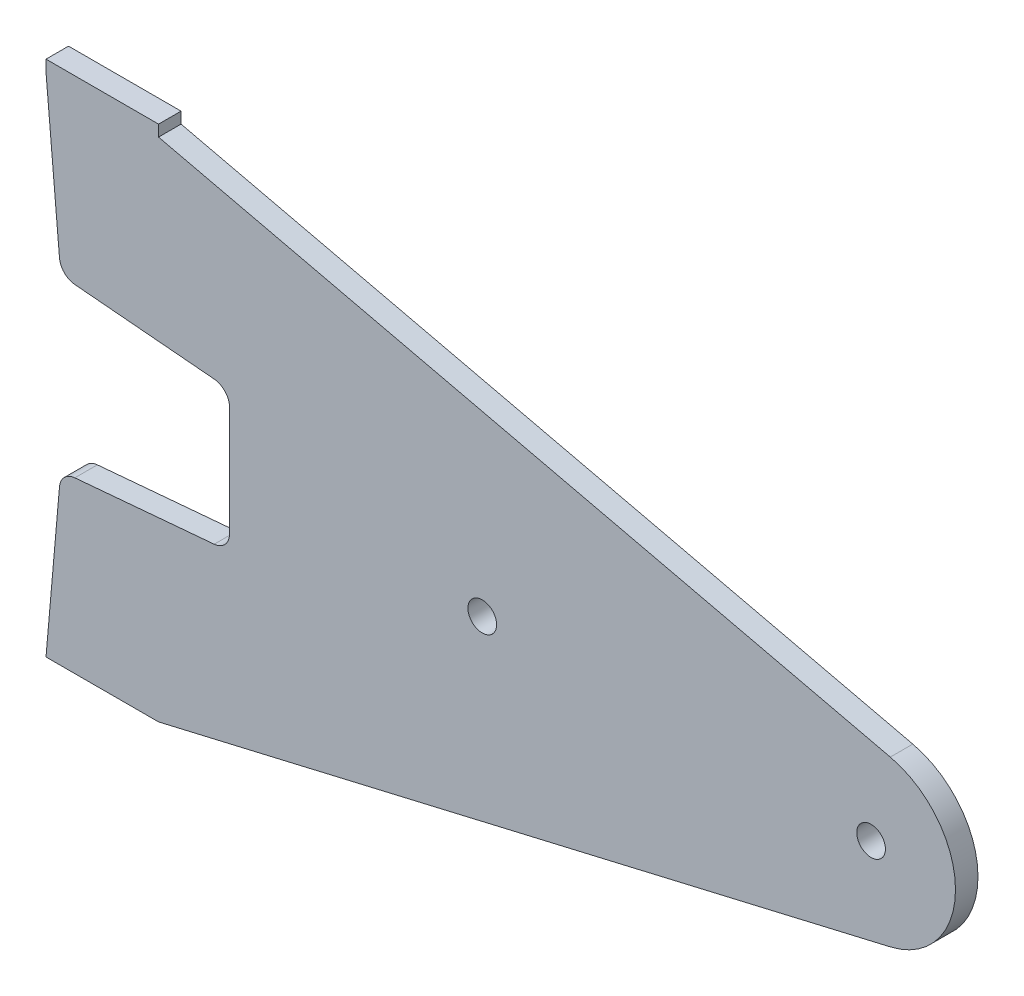
ISO-10303-21;
HEADER;
FILE_DESCRIPTION(('STEP AP214'),'2;1');
FILE_NAME('part.step','',(''),(''),'','','');
FILE_SCHEMA(('AUTOMOTIVE_DESIGN { 1 0 10303 214 1 1 1 1 }'));
ENDSEC;
DATA;
#1=APPLICATION_CONTEXT('core data for automotive mechanical design processes');
#2=APPLICATION_PROTOCOL_DEFINITION('international standard','automotive_design',2000,#1);
#3=PRODUCT_CONTEXT('',#1,'mechanical');
#4=PRODUCT('Part','Part','',(#3));
#5=PRODUCT_RELATED_PRODUCT_CATEGORY('part','',(#4));
#6=PRODUCT_DEFINITION_FORMATION('','',#4);
#7=PRODUCT_DEFINITION_CONTEXT('part definition',#1,'design');
#8=PRODUCT_DEFINITION('design','',#6,#7);
#9=PRODUCT_DEFINITION_SHAPE('','',#8);
#10=(LENGTH_UNIT() NAMED_UNIT(*) SI_UNIT(.MILLI.,.METRE.));
#11=(NAMED_UNIT(*) PLANE_ANGLE_UNIT() SI_UNIT($,.RADIAN.));
#12=(NAMED_UNIT(*) SI_UNIT($,.STERADIAN.) SOLID_ANGLE_UNIT());
#13=UNCERTAINTY_MEASURE_WITH_UNIT(LENGTH_MEASURE(1.E-05),#10,'distance_accuracy_value','');
#14=(GEOMETRIC_REPRESENTATION_CONTEXT(3) GLOBAL_UNCERTAINTY_ASSIGNED_CONTEXT((#13)) GLOBAL_UNIT_ASSIGNED_CONTEXT((#10,
#11,#12)) REPRESENTATION_CONTEXT('',''));
#15=CARTESIAN_POINT('',(0.,0.,0.));
#16=DIRECTION('',(0.,0.,1.));
#17=DIRECTION('',(1.,0.,0.));
#18=AXIS2_PLACEMENT_3D('',#15,#16,#17);
#19=CARTESIAN_POINT('',(159.09516778292,0.,4.));
#20=DIRECTION('',(0.,0.,-1.));
#21=DIRECTION('',(-1.,0.,0.));
#22=AXIS2_PLACEMENT_3D('',#19,#20,#21);
#23=PLANE('',#22);
#24=CARTESIAN_POINT('',(159.09516778292,0.,4.));
#25=DIRECTION('',(0.,0.,1.));
#26=DIRECTION('',(1.,0.,0.));
#27=AXIS2_PLACEMENT_3D('',#24,#25,#26);
#28=CIRCLE('',#27,2.54999999999999);
#29=CARTESIAN_POINT('',(161.64516778292,0.,4.));
#30=VERTEX_POINT('',#29);
#31=EDGE_CURVE('E189',#30,#30,#28,.T.);
#32=ORIENTED_EDGE('',*,*,#31,.F.);
#33=EDGE_LOOP('',(#32));
#34=FACE_BOUND('',#33,.T.);
#35=DIRECTION('',(0.,-1.,0.));
#36=VECTOR('',#35,1.);
#37=CARTESIAN_POINT('',(12.4746193717496,45.0087166950281,4.));
#38=LINE('',#37,#36);
#39=CARTESIAN_POINT('',(12.4746193717496,47.,4.));
#40=VERTEX_POINT('',#39);
#41=CARTESIAN_POINT('',(12.4746193717496,45.0087166950281,4.));
#42=VERTEX_POINT('',#41);
#43=EDGE_CURVE('E219',#40,#42,#38,.T.);
#44=ORIENTED_EDGE('',*,*,#43,.T.);
#45=DIRECTION('',(0.0871669502809188,-0.996193717496112,0.));
#46=VECTOR('',#45,1.);
#47=CARTESIAN_POINT('',(12.7062507581159,42.3615008508427,4.));
#48=LINE('',#47,#46);
#49=CARTESIAN_POINT('',(14.8728851091224,17.599965410768,4.));
#50=VERTEX_POINT('',#49);
#51=EDGE_CURVE('E121',#42,#50,#48,.T.);
#52=ORIENTED_EDGE('',*,*,#51,.T.);
#53=CARTESIAN_POINT('',(17.8614662616107,17.8614662616107,4.));
#54=DIRECTION('',(0.,0.,1.));
#55=DIRECTION('',(1.,0.,0.));
#56=AXIS2_PLACEMENT_3D('',#53,#54,#55);
#57=CIRCLE('',#56,3.);
#58=CARTESIAN_POINT('',(17.599965410768,14.8728851091224,4.));
#59=VERTEX_POINT('',#58);
#60=EDGE_CURVE('E261',#50,#59,#57,.T.);
#61=ORIENTED_EDGE('',*,*,#60,.T.);
#62=DIRECTION('',(0.996193717496113,-0.0871669502809097,0.));
#63=VECTOR('',#62,1.);
#64=CARTESIAN_POINT('',(17.599965410768,14.8728851091224,4.));
#65=LINE('',#64,#63);
#66=CARTESIAN_POINT('',(42.3615008508427,12.7062507581158,4.));
#67=VERTEX_POINT('',#66);
#68=EDGE_CURVE('E280',#59,#67,#65,.T.);
#69=ORIENTED_EDGE('',*,*,#68,.T.);
#70=CARTESIAN_POINT('',(42.1,9.71766960562749,4.));
#71=DIRECTION('',(0.,0.,-1.));
#72=DIRECTION('',(-1.,0.,0.));
#73=AXIS2_PLACEMENT_3D('',#70,#71,#72);
#74=CIRCLE('',#73,3.);
#75=CARTESIAN_POINT('',(45.1,9.71766960562747,4.));
#76=VERTEX_POINT('',#75);
#77=EDGE_CURVE('E277',#67,#76,#74,.T.);
#78=ORIENTED_EDGE('',*,*,#77,.T.);
#79=DIRECTION('',(0.,-1.,0.));
#80=VECTOR('',#79,1.);
#81=CARTESIAN_POINT('',(45.1,-9.71766960562747,4.));
#82=LINE('',#81,#80);
#83=CARTESIAN_POINT('',(45.1,-9.71766960562747,4.));
#84=VERTEX_POINT('',#83);
#85=EDGE_CURVE('E279',#76,#84,#82,.T.);
#86=ORIENTED_EDGE('',*,*,#85,.T.);
#87=CARTESIAN_POINT('',(42.1,-9.71766960562749,4.));
#88=DIRECTION('',(0.,0.,-1.));
#89=DIRECTION('',(1.,0.,0.));
#90=AXIS2_PLACEMENT_3D('',#87,#88,#89);
#91=CIRCLE('',#90,3.);
#92=CARTESIAN_POINT('',(42.3615008508427,-12.7062507581158,4.));
#93=VERTEX_POINT('',#92);
#94=EDGE_CURVE('E282',#84,#93,#91,.T.);
#95=ORIENTED_EDGE('',*,*,#94,.T.);
#96=DIRECTION('',(-0.996193717496113,-0.0871669502809097,0.));
#97=VECTOR('',#96,1.);
#98=CARTESIAN_POINT('',(17.599965410768,-14.8728851091224,4.));
#99=LINE('',#98,#97);
#100=CARTESIAN_POINT('',(17.599965410768,-14.8728851091224,4.));
#101=VERTEX_POINT('',#100);
#102=EDGE_CURVE('E288',#93,#101,#99,.T.);
#103=ORIENTED_EDGE('',*,*,#102,.T.);
#104=CARTESIAN_POINT('',(17.8614662616107,-17.8614662616107,4.));
#105=DIRECTION('',(0.,0.,1.));
#106=DIRECTION('',(-1.,0.,0.));
#107=AXIS2_PLACEMENT_3D('',#104,#105,#106);
#108=CIRCLE('',#107,3.);
#109=CARTESIAN_POINT('',(14.8728851091224,-17.599965410768,4.));
#110=VERTEX_POINT('',#109);
#111=EDGE_CURVE('E290',#101,#110,#108,.T.);
#112=ORIENTED_EDGE('',*,*,#111,.T.);
#113=DIRECTION('',(-0.0871669502809082,-0.996193717496113,0.));
#114=VECTOR('',#113,1.);
#115=CARTESIAN_POINT('',(14.8728851091224,-17.599965410768,4.));
#116=LINE('',#115,#114);
#117=CARTESIAN_POINT('',(12.4746193717496,-45.0087166950281,4.));
#118=VERTEX_POINT('',#117);
#119=EDGE_CURVE('E292',#110,#118,#116,.T.);
#120=ORIENTED_EDGE('',*,*,#119,.T.);
#121=DIRECTION('',(0.999999905024048,0.000435834710011383,0.));
#122=VECTOR('',#121,1.);
#123=CARTESIAN_POINT('',(32.1293407648967,-45.0001504844158,4.));
#124=LINE('',#123,#122);
#125=CARTESIAN_POINT('',(32.1293407648967,-45.0001504844158,4.));
#126=VERTEX_POINT('',#125);
#127=EDGE_CURVE('E294',#118,#126,#124,.T.);
#128=ORIENTED_EDGE('',*,*,#127,.T.);
#129=CARTESIAN_POINT('',(32.1280332607666,-42.0001507693436,4.));
#130=DIRECTION('',(0.,0.,1.));
#131=DIRECTION('',(1.,0.,0.));
#132=AXIS2_PLACEMENT_3D('',#129,#130,#131);
#133=CIRCLE('',#132,3.);
#134=CARTESIAN_POINT('',(32.8108360005078,-44.9214142662918,4.));
#135=VERTEX_POINT('',#134);
#136=EDGE_CURVE('E296',#126,#135,#133,.T.);
#137=ORIENTED_EDGE('',*,*,#136,.T.);
#138=DIRECTION('',(0.973754498982734,0.227600913247036,0.));
#139=VECTOR('',#138,1.);
#140=CARTESIAN_POINT('',(32.8108360005078,-44.9214142662918,4.));
#141=LINE('',#140,#139);
#142=CARTESIAN_POINT('',(162.509181481625,-14.6063174847412,4.));
#143=VERTEX_POINT('',#142);
#144=EDGE_CURVE('E298',#135,#143,#141,.T.);
#145=ORIENTED_EDGE('',*,*,#144,.T.);
#146=CARTESIAN_POINT('',(159.09516778292,0.,4.));
#147=DIRECTION('',(0.,0.,1.));
#148=DIRECTION('',(-1.,0.,0.));
#149=AXIS2_PLACEMENT_3D('',#146,#147,#148);
#150=CIRCLE('',#149,15.);
#151=CARTESIAN_POINT('',(162.509181481625,14.6063174847412,4.));
#152=VERTEX_POINT('',#151);
#153=EDGE_CURVE('E167',#143,#152,#150,.T.);
#154=ORIENTED_EDGE('',*,*,#153,.T.);
#155=DIRECTION('',(-0.973754498982734,0.227600913247036,0.));
#156=VECTOR('',#155,1.);
#157=CARTESIAN_POINT('',(32.4746193717497,45.,4.));
#158=LINE('',#157,#156);
#159=CARTESIAN_POINT('',(32.4746193717497,45.,4.));
#160=VERTEX_POINT('',#159);
#161=EDGE_CURVE('E161',#152,#160,#158,.T.);
#162=ORIENTED_EDGE('',*,*,#161,.T.);
#163=DIRECTION('',(0.,1.,0.));
#164=VECTOR('',#163,1.);
#165=CARTESIAN_POINT('',(32.4746193717497,47.,4.));
#166=LINE('',#165,#164);
#167=CARTESIAN_POINT('',(32.4746193717497,47.,4.));
#168=VERTEX_POINT('',#167);
#169=EDGE_CURVE('E165',#160,#168,#166,.T.);
#170=ORIENTED_EDGE('',*,*,#169,.T.);
#171=DIRECTION('',(-1.,0.,0.));
#172=VECTOR('',#171,1.);
#173=CARTESIAN_POINT('',(12.4746193717496,47.,4.));
#174=LINE('',#173,#172);
#175=EDGE_CURVE('E51',#168,#40,#174,.T.);
#176=ORIENTED_EDGE('',*,*,#175,.T.);
#177=EDGE_LOOP('',(#44,#52,#61,#69,#78,#86,#95,#103,#112,#120,#128,#137,#145,#154,#162,#170,#176));
#178=FACE_BOUND('',#177,.T.);
#179=CARTESIAN_POINT('',(90.,0.,4.));
#180=DIRECTION('',(0.,0.,1.));
#181=DIRECTION('',(1.,0.,0.));
#182=AXIS2_PLACEMENT_3D('',#179,#180,#181);
#183=CIRCLE('',#182,2.54999999999999);
#184=CARTESIAN_POINT('',(92.55,0.,4.));
#185=VERTEX_POINT('',#184);
#186=EDGE_CURVE('E341',#185,#185,#183,.T.);
#187=ORIENTED_EDGE('',*,*,#186,.F.);
#188=EDGE_LOOP('',(#187));
#189=FACE_BOUND('',#188,.T.);
#190=ADVANCED_FACE('F34',(#34,#178,#189),#23,.F.);
#191=CARTESIAN_POINT('',(159.09516778292,0.,0.));
#192=DIRECTION('',(0.,0.,-1.));
#193=DIRECTION('',(-1.,0.,0.));
#194=AXIS2_PLACEMENT_3D('',#191,#192,#193);
#195=PLANE('',#194);
#196=CARTESIAN_POINT('',(159.09516778292,0.,0.));
#197=DIRECTION('',(0.,0.,1.));
#198=DIRECTION('',(1.,0.,0.));
#199=AXIS2_PLACEMENT_3D('',#196,#197,#198);
#200=CIRCLE('',#199,2.54999999999999);
#201=CARTESIAN_POINT('',(161.64516778292,0.,0.));
#202=VERTEX_POINT('',#201);
#203=EDGE_CURVE('E346',#202,#202,#200,.T.);
#204=ORIENTED_EDGE('',*,*,#203,.T.);
#205=EDGE_LOOP('',(#204));
#206=FACE_BOUND('',#205,.T.);
#207=DIRECTION('',(0.,-1.,0.));
#208=VECTOR('',#207,1.);
#209=CARTESIAN_POINT('',(12.4746193717496,45.0087166950281,0.));
#210=LINE('',#209,#208);
#211=CARTESIAN_POINT('',(12.4746193717496,47.,0.));
#212=VERTEX_POINT('',#211);
#213=CARTESIAN_POINT('',(12.4746193717496,45.0087166950281,0.));
#214=VERTEX_POINT('',#213);
#215=EDGE_CURVE('E185',#212,#214,#210,.T.);
#216=ORIENTED_EDGE('',*,*,#215,.F.);
#217=DIRECTION('',(-1.,0.,0.));
#218=VECTOR('',#217,1.);
#219=CARTESIAN_POINT('',(12.4746193717496,47.,0.));
#220=LINE('',#219,#218);
#221=CARTESIAN_POINT('',(32.4746193717497,47.,0.));
#222=VERTEX_POINT('',#221);
#223=EDGE_CURVE('E113',#222,#212,#220,.T.);
#224=ORIENTED_EDGE('',*,*,#223,.F.);
#225=DIRECTION('',(0.,1.,0.));
#226=VECTOR('',#225,1.);
#227=CARTESIAN_POINT('',(32.4746193717497,47.,0.));
#228=LINE('',#227,#226);
#229=CARTESIAN_POINT('',(32.4746193717497,45.,0.));
#230=VERTEX_POINT('',#229);
#231=EDGE_CURVE('E107',#230,#222,#228,.T.);
#232=ORIENTED_EDGE('',*,*,#231,.F.);
#233=DIRECTION('',(-0.973754498982734,0.227600913247036,0.));
#234=VECTOR('',#233,1.);
#235=CARTESIAN_POINT('',(32.4746193717497,45.,0.));
#236=LINE('',#235,#234);
#237=CARTESIAN_POINT('',(162.509181481625,14.6063174847412,0.));
#238=VERTEX_POINT('',#237);
#239=EDGE_CURVE('E175',#238,#230,#236,.T.);
#240=ORIENTED_EDGE('',*,*,#239,.F.);
#241=CARTESIAN_POINT('',(159.09516778292,0.,0.));
#242=DIRECTION('',(0.,0.,1.));
#243=DIRECTION('',(-1.,0.,0.));
#244=AXIS2_PLACEMENT_3D('',#241,#242,#243);
#245=CIRCLE('',#244,15.);
#246=CARTESIAN_POINT('',(162.509181481625,-14.6063174847412,0.));
#247=VERTEX_POINT('',#246);
#248=EDGE_CURVE('E214',#247,#238,#245,.T.);
#249=ORIENTED_EDGE('',*,*,#248,.F.);
#250=DIRECTION('',(0.973754498982734,0.227600913247036,0.));
#251=VECTOR('',#250,1.);
#252=CARTESIAN_POINT('',(32.8108360005078,-44.9214142662918,0.));
#253=LINE('',#252,#251);
#254=CARTESIAN_POINT('',(32.8108360005078,-44.9214142662918,0.));
#255=VERTEX_POINT('',#254);
#256=EDGE_CURVE('E212',#255,#247,#253,.T.);
#257=ORIENTED_EDGE('',*,*,#256,.F.);
#258=CARTESIAN_POINT('',(32.1280332607666,-42.0001507693436,0.));
#259=DIRECTION('',(0.,0.,1.));
#260=DIRECTION('',(1.,0.,0.));
#261=AXIS2_PLACEMENT_3D('',#258,#259,#260);
#262=CIRCLE('',#261,3.);
#263=CARTESIAN_POINT('',(32.1293407648967,-45.0001504844158,0.));
#264=VERTEX_POINT('',#263);
#265=EDGE_CURVE('E210',#264,#255,#262,.T.);
#266=ORIENTED_EDGE('',*,*,#265,.F.);
#267=DIRECTION('',(0.999999905024048,0.000435834710011383,0.));
#268=VECTOR('',#267,1.);
#269=CARTESIAN_POINT('',(32.1293407648967,-45.0001504844158,0.));
#270=LINE('',#269,#268);
#271=CARTESIAN_POINT('',(12.4746193717496,-45.0087166950281,0.));
#272=VERTEX_POINT('',#271);
#273=EDGE_CURVE('E208',#272,#264,#270,.T.);
#274=ORIENTED_EDGE('',*,*,#273,.F.);
#275=DIRECTION('',(-0.0871669502809188,-0.996193717496112,0.));
#276=VECTOR('',#275,1.);
#277=CARTESIAN_POINT('',(12.7062507581159,-42.3615008508427,0.));
#278=LINE('',#277,#276);
#279=CARTESIAN_POINT('',(14.8728851091224,-17.599965410768,0.));
#280=VERTEX_POINT('',#279);
#281=EDGE_CURVE('E206',#280,#272,#278,.T.);
#282=ORIENTED_EDGE('',*,*,#281,.F.);
#283=CARTESIAN_POINT('',(17.8614662616107,-17.8614662616107,0.));
#284=DIRECTION('',(0.,0.,1.));
#285=DIRECTION('',(-1.,0.,0.));
#286=AXIS2_PLACEMENT_3D('',#283,#284,#285);
#287=CIRCLE('',#286,3.);
#288=CARTESIAN_POINT('',(17.599965410768,-14.8728851091224,0.));
#289=VERTEX_POINT('',#288);
#290=EDGE_CURVE('E203',#289,#280,#287,.T.);
#291=ORIENTED_EDGE('',*,*,#290,.F.);
#292=DIRECTION('',(-0.996193717496113,-0.0871669502809097,0.));
#293=VECTOR('',#292,1.);
#294=CARTESIAN_POINT('',(17.599965410768,-14.8728851091224,0.));
#295=LINE('',#294,#293);
#296=CARTESIAN_POINT('',(42.3615008508427,-12.7062507581158,0.));
#297=VERTEX_POINT('',#296);
#298=EDGE_CURVE('E201',#297,#289,#295,.T.);
#299=ORIENTED_EDGE('',*,*,#298,.F.);
#300=CARTESIAN_POINT('',(42.1,-9.71766960562749,0.));
#301=DIRECTION('',(0.,0.,-1.));
#302=DIRECTION('',(1.,0.,0.));
#303=AXIS2_PLACEMENT_3D('',#300,#301,#302);
#304=CIRCLE('',#303,3.);
#305=CARTESIAN_POINT('',(45.1,-9.71766960562747,0.));
#306=VERTEX_POINT('',#305);
#307=EDGE_CURVE('E199',#306,#297,#304,.T.);
#308=ORIENTED_EDGE('',*,*,#307,.F.);
#309=DIRECTION('',(0.,-1.,0.));
#310=VECTOR('',#309,1.);
#311=CARTESIAN_POINT('',(45.1,-9.71766960562747,0.));
#312=LINE('',#311,#310);
#313=CARTESIAN_POINT('',(45.1,9.71766960562747,0.));
#314=VERTEX_POINT('',#313);
#315=EDGE_CURVE('E197',#314,#306,#312,.T.);
#316=ORIENTED_EDGE('',*,*,#315,.F.);
#317=CARTESIAN_POINT('',(42.1,9.71766960562749,0.));
#318=DIRECTION('',(0.,0.,-1.));
#319=DIRECTION('',(-1.,0.,0.));
#320=AXIS2_PLACEMENT_3D('',#317,#318,#319);
#321=CIRCLE('',#320,3.);
#322=CARTESIAN_POINT('',(42.3615008508427,12.7062507581158,0.));
#323=VERTEX_POINT('',#322);
#324=EDGE_CURVE('E195',#323,#314,#321,.T.);
#325=ORIENTED_EDGE('',*,*,#324,.F.);
#326=DIRECTION('',(0.996193717496113,-0.0871669502809097,0.));
#327=VECTOR('',#326,1.);
#328=CARTESIAN_POINT('',(17.599965410768,14.8728851091224,0.));
#329=LINE('',#328,#327);
#330=CARTESIAN_POINT('',(17.599965410768,14.8728851091224,0.));
#331=VERTEX_POINT('',#330);
#332=EDGE_CURVE('E193',#331,#323,#329,.T.);
#333=ORIENTED_EDGE('',*,*,#332,.F.);
#334=CARTESIAN_POINT('',(17.8614662616107,17.8614662616107,0.));
#335=DIRECTION('',(0.,0.,1.));
#336=DIRECTION('',(1.,0.,0.));
#337=AXIS2_PLACEMENT_3D('',#334,#335,#336);
#338=CIRCLE('',#337,3.);
#339=CARTESIAN_POINT('',(14.8728851091224,17.599965410768,0.));
#340=VERTEX_POINT('',#339);
#341=EDGE_CURVE('E191',#340,#331,#338,.T.);
#342=ORIENTED_EDGE('',*,*,#341,.F.);
#343=DIRECTION('',(0.0871669502809082,-0.996193717496113,0.));
#344=VECTOR('',#343,1.);
#345=CARTESIAN_POINT('',(14.8728851091224,17.599965410768,0.));
#346=LINE('',#345,#344);
#347=EDGE_CURVE('E188',#214,#340,#346,.T.);
#348=ORIENTED_EDGE('',*,*,#347,.F.);
#349=EDGE_LOOP('',(#216,#224,#232,#240,#249,#257,#266,#274,#282,#291,#299,#308,#316,#325,#333,
#342,#348));
#350=FACE_BOUND('',#349,.T.);
#351=CARTESIAN_POINT('',(90.,0.,0.));
#352=DIRECTION('',(0.,0.,1.));
#353=DIRECTION('',(1.,0.,0.));
#354=AXIS2_PLACEMENT_3D('',#351,#352,#353);
#355=CIRCLE('',#354,2.54999999999999);
#356=CARTESIAN_POINT('',(92.55,0.,0.));
#357=VERTEX_POINT('',#356);
#358=EDGE_CURVE('E344',#357,#357,#355,.T.);
#359=ORIENTED_EDGE('',*,*,#358,.T.);
#360=EDGE_LOOP('',(#359));
#361=FACE_BOUND('',#360,.T.);
#362=ADVANCED_FACE('F265',(#206,#350,#361),#195,.T.);
#363=CARTESIAN_POINT('',(12.4746193717496,45.0087166950281,4.));
#364=DIRECTION('',(1.,0.,0.));
#365=DIRECTION('',(0.,1.,0.));
#366=AXIS2_PLACEMENT_3D('',#363,#364,#365);
#367=PLANE('',#366);
#368=ORIENTED_EDGE('',*,*,#215,.T.);
#369=DIRECTION('',(0.,0.,-1.));
#370=VECTOR('',#369,1.);
#371=CARTESIAN_POINT('',(12.4746193717496,45.0087166950281,4.));
#372=LINE('',#371,#370);
#373=EDGE_CURVE('E11',#42,#214,#372,.T.);
#374=ORIENTED_EDGE('',*,*,#373,.F.);
#375=ORIENTED_EDGE('',*,*,#43,.F.);
#376=DIRECTION('',(0.,0.,-1.));
#377=VECTOR('',#376,1.);
#378=CARTESIAN_POINT('',(12.4746193717496,47.,4.));
#379=LINE('',#378,#377);
#380=EDGE_CURVE('E181',#40,#212,#379,.T.);
#381=ORIENTED_EDGE('',*,*,#380,.T.);
#382=EDGE_LOOP('',(#368,#374,#375,#381));
#383=FACE_BOUND('',#382,.T.);
#384=ADVANCED_FACE('F36',(#383),#367,.F.);
#385=CARTESIAN_POINT('',(14.8728851091224,17.599965410768,4.));
#386=DIRECTION('',(0.996193717496113,0.0871669502809082,0.));
#387=DIRECTION('',(-0.0871669502809082,0.996193717496113,0.));
#388=AXIS2_PLACEMENT_3D('',#385,#386,#387);
#389=PLANE('',#388);
#390=ORIENTED_EDGE('',*,*,#347,.T.);
#391=DIRECTION('',(0.,0.,-1.));
#392=VECTOR('',#391,1.);
#393=CARTESIAN_POINT('',(14.8728851091224,17.599965410768,4.));
#394=LINE('',#393,#392);
#395=EDGE_CURVE('E43',#50,#340,#394,.T.);
#396=ORIENTED_EDGE('',*,*,#395,.F.);
#397=ORIENTED_EDGE('',*,*,#51,.F.);
#398=ORIENTED_EDGE('',*,*,#373,.T.);
#399=EDGE_LOOP('',(#390,#396,#397,#398));
#400=FACE_BOUND('',#399,.T.);
#401=ADVANCED_FACE('F490',(#400),#389,.F.);
#402=CARTESIAN_POINT('',(17.8614662616107,17.8614662616107,4.));
#403=DIRECTION('',(0.,0.,-1.));
#404=DIRECTION('',(-1.,0.,0.));
#405=AXIS2_PLACEMENT_3D('',#402,#403,#404);
#406=CYLINDRICAL_SURFACE('',#405,3.);
#407=ORIENTED_EDGE('',*,*,#341,.T.);
#408=DIRECTION('',(0.,0.,-1.));
#409=VECTOR('',#408,1.);
#410=CARTESIAN_POINT('',(17.599965410768,14.8728851091224,4.));
#411=LINE('',#410,#409);
#412=EDGE_CURVE('E253',#59,#331,#411,.T.);
#413=ORIENTED_EDGE('',*,*,#412,.F.);
#414=ORIENTED_EDGE('',*,*,#60,.F.);
#415=ORIENTED_EDGE('',*,*,#395,.T.);
#416=EDGE_LOOP('',(#407,#413,#414,#415));
#417=FACE_BOUND('',#416,.T.);
#418=ADVANCED_FACE('F259',(#417),#406,.T.);
#419=CARTESIAN_POINT('',(17.599965410768,14.8728851091224,4.));
#420=DIRECTION('',(0.0871669502809097,0.996193717496113,0.));
#421=DIRECTION('',(-0.996193717496113,0.0871669502809097,0.));
#422=AXIS2_PLACEMENT_3D('',#419,#420,#421);
#423=PLANE('',#422);
#424=ORIENTED_EDGE('',*,*,#332,.T.);
#425=DIRECTION('',(0.,0.,-1.));
#426=VECTOR('',#425,1.);
#427=CARTESIAN_POINT('',(42.3615008508427,12.7062507581158,4.));
#428=LINE('',#427,#426);
#429=EDGE_CURVE('E250',#67,#323,#428,.T.);
#430=ORIENTED_EDGE('',*,*,#429,.F.);
#431=ORIENTED_EDGE('',*,*,#68,.F.);
#432=ORIENTED_EDGE('',*,*,#412,.T.);
#433=EDGE_LOOP('',(#424,#430,#431,#432));
#434=FACE_BOUND('',#433,.T.);
#435=ADVANCED_FACE('F271',(#434),#423,.F.);
#436=CARTESIAN_POINT('',(42.1,9.71766960562749,4.));
#437=DIRECTION('',(0.,0.,-1.));
#438=DIRECTION('',(-1.,0.,0.));
#439=AXIS2_PLACEMENT_3D('',#436,#437,#438);
#440=CYLINDRICAL_SURFACE('',#439,3.);
#441=ORIENTED_EDGE('',*,*,#324,.T.);
#442=DIRECTION('',(0.,0.,-1.));
#443=VECTOR('',#442,1.);
#444=CARTESIAN_POINT('',(45.1,9.71766960562747,4.));
#445=LINE('',#444,#443);
#446=EDGE_CURVE('E247',#76,#314,#445,.T.);
#447=ORIENTED_EDGE('',*,*,#446,.F.);
#448=ORIENTED_EDGE('',*,*,#77,.F.);
#449=ORIENTED_EDGE('',*,*,#429,.T.);
#450=EDGE_LOOP('',(#441,#447,#448,#449));
#451=FACE_BOUND('',#450,.T.);
#452=ADVANCED_FACE('F275',(#451),#440,.F.);
#453=CARTESIAN_POINT('',(45.1,-9.71766960562747,4.));
#454=DIRECTION('',(1.,0.,0.));
#455=DIRECTION('',(0.,0.,-1.));
#456=AXIS2_PLACEMENT_3D('',#453,#454,#455);
#457=PLANE('',#456);
#458=ORIENTED_EDGE('',*,*,#315,.T.);
#459=DIRECTION('',(0.,0.,-1.));
#460=VECTOR('',#459,1.);
#461=CARTESIAN_POINT('',(45.1,-9.71766960562747,4.));
#462=LINE('',#461,#460);
#463=EDGE_CURVE('E244',#84,#306,#462,.T.);
#464=ORIENTED_EDGE('',*,*,#463,.F.);
#465=ORIENTED_EDGE('',*,*,#85,.F.);
#466=ORIENTED_EDGE('',*,*,#446,.T.);
#467=EDGE_LOOP('',(#458,#464,#465,#466));
#468=FACE_BOUND('',#467,.T.);
#469=ADVANCED_FACE('F455',(#468),#457,.F.);
#470=CARTESIAN_POINT('',(42.1,-9.71766960562749,4.));
#471=DIRECTION('',(0.,0.,-1.));
#472=DIRECTION('',(-1.,0.,0.));
#473=AXIS2_PLACEMENT_3D('',#470,#471,#472);
#474=CYLINDRICAL_SURFACE('',#473,3.);
#475=ORIENTED_EDGE('',*,*,#307,.T.);
#476=DIRECTION('',(0.,0.,-1.));
#477=VECTOR('',#476,1.);
#478=CARTESIAN_POINT('',(42.3615008508427,-12.7062507581158,4.));
#479=LINE('',#478,#477);
#480=EDGE_CURVE('E241',#93,#297,#479,.T.);
#481=ORIENTED_EDGE('',*,*,#480,.F.);
#482=ORIENTED_EDGE('',*,*,#94,.F.);
#483=ORIENTED_EDGE('',*,*,#463,.T.);
#484=EDGE_LOOP('',(#475,#481,#482,#483));
#485=FACE_BOUND('',#484,.T.);
#486=ADVANCED_FACE('F445',(#485),#474,.F.);
#487=CARTESIAN_POINT('',(17.599965410768,-14.8728851091224,4.));
#488=DIRECTION('',(0.0871669502809097,-0.996193717496113,0.));
#489=DIRECTION('',(0.996193717496113,0.0871669502809097,0.));
#490=AXIS2_PLACEMENT_3D('',#487,#488,#489);
#491=PLANE('',#490);
#492=ORIENTED_EDGE('',*,*,#298,.T.);
#493=DIRECTION('',(0.,0.,-1.));
#494=VECTOR('',#493,1.);
#495=CARTESIAN_POINT('',(17.599965410768,-14.8728851091224,4.));
#496=LINE('',#495,#494);
#497=EDGE_CURVE('E238',#101,#289,#496,.T.);
#498=ORIENTED_EDGE('',*,*,#497,.F.);
#499=ORIENTED_EDGE('',*,*,#102,.F.);
#500=ORIENTED_EDGE('',*,*,#480,.T.);
#501=EDGE_LOOP('',(#492,#498,#499,#500));
#502=FACE_BOUND('',#501,.T.);
#503=ADVANCED_FACE('F435',(#502),#491,.F.);
#504=CARTESIAN_POINT('',(17.8614662616107,-17.8614662616107,4.));
#505=DIRECTION('',(0.,0.,-1.));
#506=DIRECTION('',(-1.,0.,0.));
#507=AXIS2_PLACEMENT_3D('',#504,#505,#506);
#508=CYLINDRICAL_SURFACE('',#507,3.);
#509=ORIENTED_EDGE('',*,*,#290,.T.);
#510=DIRECTION('',(0.,0.,-1.));
#511=VECTOR('',#510,1.);
#512=CARTESIAN_POINT('',(14.8728851091224,-17.599965410768,4.));
#513=LINE('',#512,#511);
#514=EDGE_CURVE('E235',#110,#280,#513,.T.);
#515=ORIENTED_EDGE('',*,*,#514,.F.);
#516=ORIENTED_EDGE('',*,*,#111,.F.);
#517=ORIENTED_EDGE('',*,*,#497,.T.);
#518=EDGE_LOOP('',(#509,#515,#516,#517));
#519=FACE_BOUND('',#518,.T.);
#520=ADVANCED_FACE('F424',(#519),#508,.T.);
#521=CARTESIAN_POINT('',(12.7062507581159,-42.3615008508427,4.));
#522=DIRECTION('',(0.996193717496112,-0.0871669502809188,0.));
#523=DIRECTION('',(0.0871669502809188,0.996193717496112,0.));
#524=AXIS2_PLACEMENT_3D('',#521,#522,#523);
#525=PLANE('',#524);
#526=ORIENTED_EDGE('',*,*,#281,.T.);
#527=DIRECTION('',(0.,0.,-1.));
#528=VECTOR('',#527,1.);
#529=CARTESIAN_POINT('',(12.4746193717496,-45.0087166950281,4.));
#530=LINE('',#529,#528);
#531=EDGE_CURVE('E232',#118,#272,#530,.T.);
#532=ORIENTED_EDGE('',*,*,#531,.F.);
#533=ORIENTED_EDGE('',*,*,#119,.F.);
#534=ORIENTED_EDGE('',*,*,#514,.T.);
#535=EDGE_LOOP('',(#526,#532,#533,#534));
#536=FACE_BOUND('',#535,.T.);
#537=ADVANCED_FACE('F414',(#536),#525,.F.);
#538=CARTESIAN_POINT('',(32.1293407648967,-45.0001504844158,4.));
#539=DIRECTION('',(-0.000435834710011383,0.999999905024048,0.));
#540=DIRECTION('',(-0.999999905024048,-0.000435834710011383,0.));
#541=AXIS2_PLACEMENT_3D('',#538,#539,#540);
#542=PLANE('',#541);
#543=ORIENTED_EDGE('',*,*,#273,.T.);
#544=DIRECTION('',(0.,0.,-1.));
#545=VECTOR('',#544,1.);
#546=CARTESIAN_POINT('',(32.1293407648967,-45.0001504844158,4.));
#547=LINE('',#546,#545);
#548=EDGE_CURVE('E229',#126,#264,#547,.T.);
#549=ORIENTED_EDGE('',*,*,#548,.F.);
#550=ORIENTED_EDGE('',*,*,#127,.F.);
#551=ORIENTED_EDGE('',*,*,#531,.T.);
#552=EDGE_LOOP('',(#543,#549,#550,#551));
#553=FACE_BOUND('',#552,.T.);
#554=ADVANCED_FACE('F404',(#553),#542,.F.);
#555=CARTESIAN_POINT('',(32.1280332607666,-42.0001507693436,4.));
#556=DIRECTION('',(0.,0.,-1.));
#557=DIRECTION('',(-1.,0.,0.));
#558=AXIS2_PLACEMENT_3D('',#555,#556,#557);
#559=CYLINDRICAL_SURFACE('',#558,3.);
#560=ORIENTED_EDGE('',*,*,#265,.T.);
#561=DIRECTION('',(0.,0.,-1.));
#562=VECTOR('',#561,1.);
#563=CARTESIAN_POINT('',(32.8108360005078,-44.9214142662918,4.));
#564=LINE('',#563,#562);
#565=EDGE_CURVE('E226',#135,#255,#564,.T.);
#566=ORIENTED_EDGE('',*,*,#565,.F.);
#567=ORIENTED_EDGE('',*,*,#136,.F.);
#568=ORIENTED_EDGE('',*,*,#548,.T.);
#569=EDGE_LOOP('',(#560,#566,#567,#568));
#570=FACE_BOUND('',#569,.T.);
#571=ADVANCED_FACE('F395',(#570),#559,.T.);
#572=CARTESIAN_POINT('',(32.8108360005078,-44.9214142662918,4.));
#573=DIRECTION('',(-0.227600913247036,0.973754498982734,0.));
#574=DIRECTION('',(-0.973754498982734,-0.227600913247036,0.));
#575=AXIS2_PLACEMENT_3D('',#572,#573,#574);
#576=PLANE('',#575);
#577=ORIENTED_EDGE('',*,*,#256,.T.);
#578=DIRECTION('',(0.,0.,-1.));
#579=VECTOR('',#578,1.);
#580=CARTESIAN_POINT('',(162.509181481625,-14.6063174847412,4.));
#581=LINE('',#580,#579);
#582=EDGE_CURVE('E223',#143,#247,#581,.T.);
#583=ORIENTED_EDGE('',*,*,#582,.F.);
#584=ORIENTED_EDGE('',*,*,#144,.F.);
#585=ORIENTED_EDGE('',*,*,#565,.T.);
#586=EDGE_LOOP('',(#577,#583,#584,#585));
#587=FACE_BOUND('',#586,.T.);
#588=ADVANCED_FACE('F304',(#587),#576,.F.);
#589=CARTESIAN_POINT('',(159.09516778292,0.,4.));
#590=DIRECTION('',(0.,0.,-1.));
#591=DIRECTION('',(-1.,0.,0.));
#592=AXIS2_PLACEMENT_3D('',#589,#590,#591);
#593=CYLINDRICAL_SURFACE('',#592,15.);
#594=ORIENTED_EDGE('',*,*,#248,.T.);
#595=DIRECTION('',(0.,0.,-1.));
#596=VECTOR('',#595,1.);
#597=CARTESIAN_POINT('',(162.509181481625,14.6063174847412,4.));
#598=LINE('',#597,#596);
#599=EDGE_CURVE('E176',#152,#238,#598,.T.);
#600=ORIENTED_EDGE('',*,*,#599,.F.);
#601=ORIENTED_EDGE('',*,*,#153,.F.);
#602=ORIENTED_EDGE('',*,*,#582,.T.);
#603=EDGE_LOOP('',(#594,#600,#601,#602));
#604=FACE_BOUND('',#603,.T.);
#605=ADVANCED_FACE('F308',(#604),#593,.T.);
#606=CARTESIAN_POINT('',(32.4746193717497,45.,4.));
#607=DIRECTION('',(-0.227600913247036,-0.973754498982734,0.));
#608=DIRECTION('',(0.973754498982734,-0.227600913247036,0.));
#609=AXIS2_PLACEMENT_3D('',#606,#607,#608);
#610=PLANE('',#609);
#611=ORIENTED_EDGE('',*,*,#239,.T.);
#612=DIRECTION('',(0.,0.,-1.));
#613=VECTOR('',#612,1.);
#614=CARTESIAN_POINT('',(32.4746193717497,45.,4.));
#615=LINE('',#614,#613);
#616=EDGE_CURVE('E172',#160,#230,#615,.T.);
#617=ORIENTED_EDGE('',*,*,#616,.F.);
#618=ORIENTED_EDGE('',*,*,#161,.F.);
#619=ORIENTED_EDGE('',*,*,#599,.T.);
#620=EDGE_LOOP('',(#611,#617,#618,#619));
#621=FACE_BOUND('',#620,.T.);
#622=ADVANCED_FACE('F173',(#621),#610,.F.);
#623=CARTESIAN_POINT('',(32.4746193717497,47.,4.));
#624=DIRECTION('',(-1.,0.,0.));
#625=DIRECTION('',(0.,0.,1.));
#626=AXIS2_PLACEMENT_3D('',#623,#624,#625);
#627=PLANE('',#626);
#628=ORIENTED_EDGE('',*,*,#231,.T.);
#629=DIRECTION('',(0.,0.,-1.));
#630=VECTOR('',#629,1.);
#631=CARTESIAN_POINT('',(32.4746193717497,47.,4.));
#632=LINE('',#631,#630);
#633=EDGE_CURVE('E177',#168,#222,#632,.T.);
#634=ORIENTED_EDGE('',*,*,#633,.F.);
#635=ORIENTED_EDGE('',*,*,#169,.F.);
#636=ORIENTED_EDGE('',*,*,#616,.T.);
#637=EDGE_LOOP('',(#628,#634,#635,#636));
#638=FACE_BOUND('',#637,.T.);
#639=ADVANCED_FACE('F179',(#638),#627,.F.);
#640=CARTESIAN_POINT('',(12.4746193717496,47.,4.));
#641=DIRECTION('',(0.,-1.,0.));
#642=DIRECTION('',(1.,0.,0.));
#643=AXIS2_PLACEMENT_3D('',#640,#641,#642);
#644=PLANE('',#643);
#645=ORIENTED_EDGE('',*,*,#223,.T.);
#646=ORIENTED_EDGE('',*,*,#380,.F.);
#647=ORIENTED_EDGE('',*,*,#175,.F.);
#648=ORIENTED_EDGE('',*,*,#633,.T.);
#649=EDGE_LOOP('',(#645,#646,#647,#648));
#650=FACE_BOUND('',#649,.T.);
#651=ADVANCED_FACE('F312',(#650),#644,.F.);
#652=CARTESIAN_POINT('',(159.09516778292,0.,4.));
#653=DIRECTION('',(0.,0.,-1.));
#654=DIRECTION('',(-1.,0.,0.));
#655=AXIS2_PLACEMENT_3D('',#652,#653,#654);
#656=CYLINDRICAL_SURFACE('',#655,2.54999999999999);
#657=ORIENTED_EDGE('',*,*,#31,.T.);
#658=EDGE_LOOP('',(#657));
#659=FACE_BOUND('',#658,.T.);
#660=ORIENTED_EDGE('',*,*,#203,.F.);
#661=EDGE_LOOP('',(#660));
#662=FACE_BOUND('',#661,.T.);
#663=ADVANCED_FACE('F314',(#659,#662),#656,.F.);
#664=CARTESIAN_POINT('',(90.,0.,4.));
#665=DIRECTION('',(0.,0.,-1.));
#666=DIRECTION('',(-1.,0.,0.));
#667=AXIS2_PLACEMENT_3D('',#664,#665,#666);
#668=CYLINDRICAL_SURFACE('',#667,2.54999999999999);
#669=ORIENTED_EDGE('',*,*,#186,.T.);
#670=EDGE_LOOP('',(#669));
#671=FACE_BOUND('',#670,.T.);
#672=ORIENTED_EDGE('',*,*,#358,.F.);
#673=EDGE_LOOP('',(#672));
#674=FACE_BOUND('',#673,.T.);
#675=ADVANCED_FACE('F320',(#671,#674),#668,.F.);
#676=CLOSED_SHELL('',(#190,#362,#384,#401,#418,#435,#452,#469,#486,#503,#520,#537,#554,#571,
#588,#605,#622,#639,#651,#663,#675));
#677=MANIFOLD_SOLID_BREP('B2',#676);
#678=ADVANCED_BREP_SHAPE_REPRESENTATION('',(#18,#677),#14);
#679=SHAPE_DEFINITION_REPRESENTATION(#9,#678);
ENDSEC;
END-ISO-10303-21;
